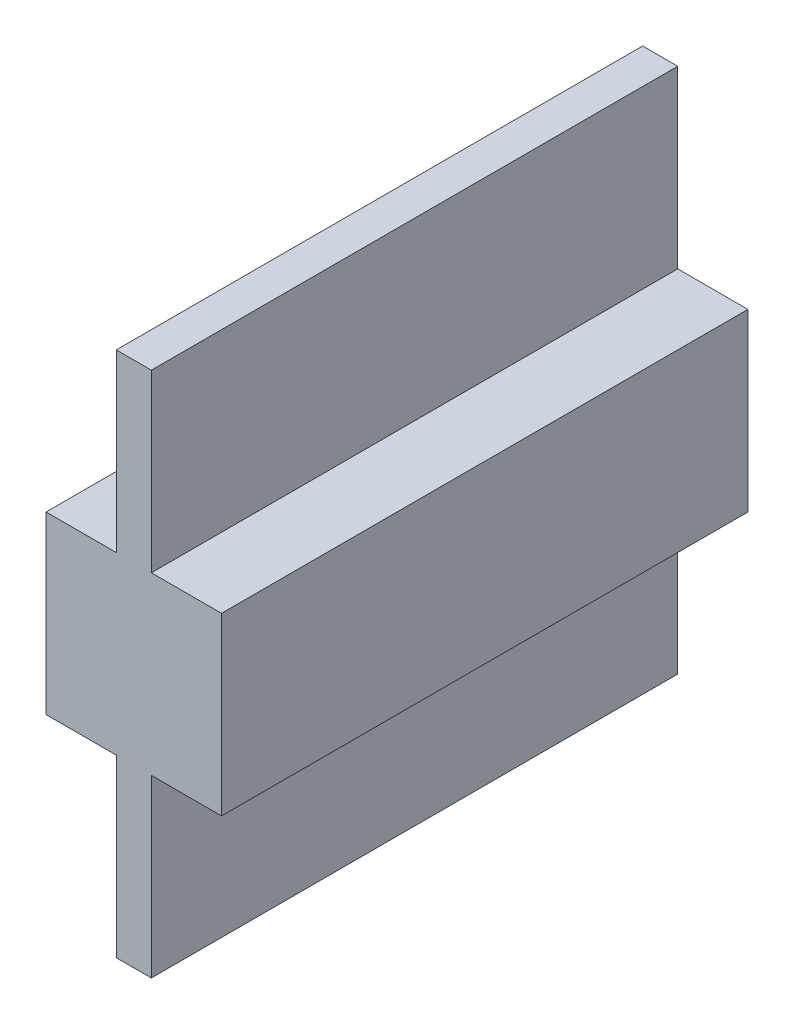
ISO-10303-21;
HEADER;
FILE_DESCRIPTION(('STEP AP214'),'2;1');
FILE_NAME('part.step','',(''),(''),'','','');
FILE_SCHEMA(('AUTOMOTIVE_DESIGN { 1 0 10303 214 1 1 1 1 }'));
ENDSEC;
DATA;
#1=APPLICATION_CONTEXT('core data for automotive mechanical design processes');
#2=APPLICATION_PROTOCOL_DEFINITION('international standard','automotive_design',2000,#1);
#3=PRODUCT_CONTEXT('',#1,'mechanical');
#4=PRODUCT('Part','Part','',(#3));
#5=PRODUCT_RELATED_PRODUCT_CATEGORY('part','',(#4));
#6=PRODUCT_DEFINITION_FORMATION('','',#4);
#7=PRODUCT_DEFINITION_CONTEXT('part definition',#1,'design');
#8=PRODUCT_DEFINITION('design','',#6,#7);
#9=PRODUCT_DEFINITION_SHAPE('','',#8);
#10=(LENGTH_UNIT() NAMED_UNIT(*) SI_UNIT(.MILLI.,.METRE.));
#11=(NAMED_UNIT(*) PLANE_ANGLE_UNIT() SI_UNIT($,.RADIAN.));
#12=(NAMED_UNIT(*) SI_UNIT($,.STERADIAN.) SOLID_ANGLE_UNIT());
#13=UNCERTAINTY_MEASURE_WITH_UNIT(LENGTH_MEASURE(1.E-05),#10,'distance_accuracy_value','');
#14=(GEOMETRIC_REPRESENTATION_CONTEXT(3) GLOBAL_UNCERTAINTY_ASSIGNED_CONTEXT((#13)) GLOBAL_UNIT_ASSIGNED_CONTEXT((#10,
#11,#12)) REPRESENTATION_CONTEXT('',''));
#15=CARTESIAN_POINT('',(0.,0.,0.));
#16=DIRECTION('',(0.,0.,1.));
#17=DIRECTION('',(1.,0.,0.));
#18=AXIS2_PLACEMENT_3D('',#15,#16,#17);
#19=CARTESIAN_POINT('',(50.,-50.,0.));
#20=DIRECTION('',(0.,-1.,0.));
#21=DIRECTION('',(0.,0.,-1.));
#22=AXIS2_PLACEMENT_3D('',#19,#20,#21);
#23=PLANE('',#22);
#24=DIRECTION('',(-1.,0.,0.));
#25=VECTOR('',#24,1.);
#26=CARTESIAN_POINT('',(50.,-50.,-150.));
#27=LINE('',#26,#25);
#28=CARTESIAN_POINT('',(-10.,-50.,-150.));
#29=VERTEX_POINT('',#28);
#30=CARTESIAN_POINT('',(-50.,-50.,-150.));
#31=VERTEX_POINT('',#30);
#32=EDGE_CURVE('E51',#29,#31,#27,.T.);
#33=ORIENTED_EDGE('',*,*,#32,.F.);
#34=DIRECTION('',(0.,0.,1.));
#35=VECTOR('',#34,1.);
#36=CARTESIAN_POINT('',(-10.,-50.,0.));
#37=LINE('',#36,#35);
#38=CARTESIAN_POINT('',(-10.,-50.,150.));
#39=VERTEX_POINT('',#38);
#40=EDGE_CURVE('E59',#29,#39,#37,.T.);
#41=ORIENTED_EDGE('',*,*,#40,.T.);
#42=DIRECTION('',(-1.,0.,0.));
#43=VECTOR('',#42,1.);
#44=CARTESIAN_POINT('',(50.,-50.,150.));
#45=LINE('',#44,#43);
#46=CARTESIAN_POINT('',(-50.,-50.,150.));
#47=VERTEX_POINT('',#46);
#48=EDGE_CURVE('E197',#39,#47,#45,.T.);
#49=ORIENTED_EDGE('',*,*,#48,.T.);
#50=DIRECTION('',(0.,0.,1.));
#51=VECTOR('',#50,1.);
#52=CARTESIAN_POINT('',(-50.,-50.,0.));
#53=LINE('',#52,#51);
#54=EDGE_CURVE('E152',#31,#47,#53,.T.);
#55=ORIENTED_EDGE('',*,*,#54,.F.);
#56=EDGE_LOOP('',(#33,#41,#49,#55));
#57=FACE_BOUND('',#56,.T.);
#58=ADVANCED_FACE('F43',(#57),#23,.T.);
#59=CARTESIAN_POINT('',(50.,50.,0.));
#60=DIRECTION('',(0.,-1.,0.));
#61=DIRECTION('',(0.,0.,-1.));
#62=AXIS2_PLACEMENT_3D('',#59,#60,#61);
#63=PLANE('',#62);
#64=DIRECTION('',(0.,0.,1.));
#65=VECTOR('',#64,1.);
#66=CARTESIAN_POINT('',(-10.,50.,0.));
#67=LINE('',#66,#65);
#68=CARTESIAN_POINT('',(-10.,50.,-150.));
#69=VERTEX_POINT('',#68);
#70=CARTESIAN_POINT('',(-10.,50.,150.));
#71=VERTEX_POINT('',#70);
#72=EDGE_CURVE('E146',#69,#71,#67,.T.);
#73=ORIENTED_EDGE('',*,*,#72,.F.);
#74=DIRECTION('',(-1.,0.,0.));
#75=VECTOR('',#74,1.);
#76=CARTESIAN_POINT('',(50.,50.,-150.));
#77=LINE('',#76,#75);
#78=CARTESIAN_POINT('',(-50.,50.,-150.));
#79=VERTEX_POINT('',#78);
#80=EDGE_CURVE('E211',#69,#79,#77,.T.);
#81=ORIENTED_EDGE('',*,*,#80,.T.);
#82=DIRECTION('',(0.,0.,1.));
#83=VECTOR('',#82,1.);
#84=CARTESIAN_POINT('',(-50.,50.,0.));
#85=LINE('',#84,#83);
#86=CARTESIAN_POINT('',(-50.,50.,150.));
#87=VERTEX_POINT('',#86);
#88=EDGE_CURVE('E203',#79,#87,#85,.T.);
#89=ORIENTED_EDGE('',*,*,#88,.T.);
#90=DIRECTION('',(-1.,0.,0.));
#91=VECTOR('',#90,1.);
#92=CARTESIAN_POINT('',(50.,50.,150.));
#93=LINE('',#92,#91);
#94=EDGE_CURVE('E208',#71,#87,#93,.T.);
#95=ORIENTED_EDGE('',*,*,#94,.F.);
#96=EDGE_LOOP('',(#73,#81,#89,#95));
#97=FACE_BOUND('',#96,.T.);
#98=ADVANCED_FACE('F217',(#97),#63,.F.);
#99=DIRECTION('',(0.,0.,1.));
#100=VECTOR('',#99,1.);
#101=CARTESIAN_POINT('',(10.,-50.,0.));
#102=LINE('',#101,#100);
#103=CARTESIAN_POINT('',(10.,-50.,-150.));
#104=VERTEX_POINT('',#103);
#105=CARTESIAN_POINT('',(10.,-50.,150.));
#106=VERTEX_POINT('',#105);
#107=EDGE_CURVE('E166',#104,#106,#102,.T.);
#108=ORIENTED_EDGE('',*,*,#107,.F.);
#109=CARTESIAN_POINT('',(50.,-50.,-150.));
#110=VERTEX_POINT('',#109);
#111=EDGE_CURVE('E11',#110,#104,#27,.T.);
#112=ORIENTED_EDGE('',*,*,#111,.F.);
#113=DIRECTION('',(0.,0.,1.));
#114=VECTOR('',#113,1.);
#115=CARTESIAN_POINT('',(50.,-50.,0.));
#116=LINE('',#115,#114);
#117=CARTESIAN_POINT('',(50.,-50.,150.));
#118=VERTEX_POINT('',#117);
#119=EDGE_CURVE('E187',#110,#118,#116,.T.);
#120=ORIENTED_EDGE('',*,*,#119,.T.);
#121=EDGE_CURVE('E206',#118,#106,#45,.T.);
#122=ORIENTED_EDGE('',*,*,#121,.T.);
#123=EDGE_LOOP('',(#108,#112,#120,#122));
#124=FACE_BOUND('',#123,.T.);
#125=ADVANCED_FACE('F44',(#124),#23,.T.);
#126=CARTESIAN_POINT('',(50.,0.,-150.));
#127=DIRECTION('',(0.,0.,-1.));
#128=DIRECTION('',(0.,1.,0.));
#129=AXIS2_PLACEMENT_3D('',#126,#127,#128);
#130=PLANE('',#129);
#131=DIRECTION('',(0.,-1.,0.));
#132=VECTOR('',#131,1.);
#133=CARTESIAN_POINT('',(-50.,0.,-150.));
#134=LINE('',#133,#132);
#135=EDGE_CURVE('E160',#79,#31,#134,.T.);
#136=ORIENTED_EDGE('',*,*,#135,.F.);
#137=ORIENTED_EDGE('',*,*,#80,.F.);
#138=DIRECTION('',(0.,1.,0.));
#139=VECTOR('',#138,1.);
#140=CARTESIAN_POINT('',(-10.,0.,-150.));
#141=LINE('',#140,#139);
#142=CARTESIAN_POINT('',(-10.,150.,-150.));
#143=VERTEX_POINT('',#142);
#144=EDGE_CURVE('E153',#69,#143,#141,.T.);
#145=ORIENTED_EDGE('',*,*,#144,.T.);
#146=DIRECTION('',(-1.,0.,0.));
#147=VECTOR('',#146,1.);
#148=CARTESIAN_POINT('',(10.,150.,-150.));
#149=LINE('',#148,#147);
#150=CARTESIAN_POINT('',(10.,150.,-150.));
#151=VERTEX_POINT('',#150);
#152=EDGE_CURVE('E133',#151,#143,#149,.T.);
#153=ORIENTED_EDGE('',*,*,#152,.F.);
#154=DIRECTION('',(0.,1.,0.));
#155=VECTOR('',#154,1.);
#156=CARTESIAN_POINT('',(10.,0.,-150.));
#157=LINE('',#156,#155);
#158=CARTESIAN_POINT('',(10.,50.,-150.));
#159=VERTEX_POINT('',#158);
#160=EDGE_CURVE('E137',#159,#151,#157,.T.);
#161=ORIENTED_EDGE('',*,*,#160,.F.);
#162=CARTESIAN_POINT('',(50.,50.,-150.));
#163=VERTEX_POINT('',#162);
#164=EDGE_CURVE('E215',#163,#159,#77,.T.);
#165=ORIENTED_EDGE('',*,*,#164,.F.);
#166=DIRECTION('',(0.,-1.,0.));
#167=VECTOR('',#166,1.);
#168=CARTESIAN_POINT('',(50.,0.,-150.));
#169=LINE('',#168,#167);
#170=EDGE_CURVE('E190',#163,#110,#169,.T.);
#171=ORIENTED_EDGE('',*,*,#170,.T.);
#172=ORIENTED_EDGE('',*,*,#111,.T.);
#173=DIRECTION('',(0.,-1.,0.));
#174=VECTOR('',#173,1.);
#175=CARTESIAN_POINT('',(10.,0.,-150.));
#176=LINE('',#175,#174);
#177=CARTESIAN_POINT('',(10.,-150.,-150.));
#178=VERTEX_POINT('',#177);
#179=EDGE_CURVE('E164',#104,#178,#176,.T.);
#180=ORIENTED_EDGE('',*,*,#179,.T.);
#181=DIRECTION('',(-1.,0.,0.));
#182=VECTOR('',#181,1.);
#183=CARTESIAN_POINT('',(10.,-150.,-150.));
#184=LINE('',#183,#182);
#185=CARTESIAN_POINT('',(-10.,-150.,-150.));
#186=VERTEX_POINT('',#185);
#187=EDGE_CURVE('E183',#178,#186,#184,.T.);
#188=ORIENTED_EDGE('',*,*,#187,.T.);
#189=DIRECTION('',(0.,-1.,0.));
#190=VECTOR('',#189,1.);
#191=CARTESIAN_POINT('',(-10.,0.,-150.));
#192=LINE('',#191,#190);
#193=EDGE_CURVE('E176',#29,#186,#192,.T.);
#194=ORIENTED_EDGE('',*,*,#193,.F.);
#195=ORIENTED_EDGE('',*,*,#32,.T.);
#196=EDGE_LOOP('',(#136,#137,#145,#153,#161,#165,#171,#172,#180,#188,#194,#195));
#197=FACE_BOUND('',#196,.T.);
#198=ADVANCED_FACE('F151',(#197),#130,.T.);
#199=ORIENTED_EDGE('',*,*,#164,.T.);
#200=DIRECTION('',(0.,0.,1.));
#201=VECTOR('',#200,1.);
#202=CARTESIAN_POINT('',(10.,50.,0.));
#203=LINE('',#202,#201);
#204=CARTESIAN_POINT('',(10.,50.,150.));
#205=VERTEX_POINT('',#204);
#206=EDGE_CURVE('E144',#159,#205,#203,.T.);
#207=ORIENTED_EDGE('',*,*,#206,.T.);
#208=CARTESIAN_POINT('',(50.,50.,150.));
#209=VERTEX_POINT('',#208);
#210=EDGE_CURVE('E207',#209,#205,#93,.T.);
#211=ORIENTED_EDGE('',*,*,#210,.F.);
#212=DIRECTION('',(0.,0.,1.));
#213=VECTOR('',#212,1.);
#214=CARTESIAN_POINT('',(50.,50.,0.));
#215=LINE('',#214,#213);
#216=EDGE_CURVE('E194',#163,#209,#215,.T.);
#217=ORIENTED_EDGE('',*,*,#216,.F.);
#218=EDGE_LOOP('',(#199,#207,#211,#217));
#219=FACE_BOUND('',#218,.T.);
#220=ADVANCED_FACE('F238',(#219),#63,.F.);
#221=CARTESIAN_POINT('',(50.,0.,150.));
#222=DIRECTION('',(0.,0.,-1.));
#223=DIRECTION('',(-1.,0.,0.));
#224=AXIS2_PLACEMENT_3D('',#221,#222,#223);
#225=PLANE('',#224);
#226=DIRECTION('',(0.,-1.,0.));
#227=VECTOR('',#226,1.);
#228=CARTESIAN_POINT('',(-50.,0.,150.));
#229=LINE('',#228,#227);
#230=EDGE_CURVE('E193',#87,#47,#229,.T.);
#231=ORIENTED_EDGE('',*,*,#230,.T.);
#232=ORIENTED_EDGE('',*,*,#48,.F.);
#233=DIRECTION('',(0.,-1.,0.));
#234=VECTOR('',#233,1.);
#235=CARTESIAN_POINT('',(-10.,0.,150.));
#236=LINE('',#235,#234);
#237=CARTESIAN_POINT('',(-10.,-150.,150.));
#238=VERTEX_POINT('',#237);
#239=EDGE_CURVE('E167',#39,#238,#236,.T.);
#240=ORIENTED_EDGE('',*,*,#239,.T.);
#241=DIRECTION('',(-1.,0.,0.));
#242=VECTOR('',#241,1.);
#243=CARTESIAN_POINT('',(10.,-150.,150.));
#244=LINE('',#243,#242);
#245=CARTESIAN_POINT('',(10.,-150.,150.));
#246=VERTEX_POINT('',#245);
#247=EDGE_CURVE('E173',#246,#238,#244,.T.);
#248=ORIENTED_EDGE('',*,*,#247,.F.);
#249=DIRECTION('',(0.,-1.,0.));
#250=VECTOR('',#249,1.);
#251=CARTESIAN_POINT('',(10.,0.,150.));
#252=LINE('',#251,#250);
#253=EDGE_CURVE('E172',#106,#246,#252,.T.);
#254=ORIENTED_EDGE('',*,*,#253,.F.);
#255=ORIENTED_EDGE('',*,*,#121,.F.);
#256=DIRECTION('',(0.,-1.,0.));
#257=VECTOR('',#256,1.);
#258=CARTESIAN_POINT('',(50.,0.,150.));
#259=LINE('',#258,#257);
#260=EDGE_CURVE('E198',#209,#118,#259,.T.);
#261=ORIENTED_EDGE('',*,*,#260,.F.);
#262=ORIENTED_EDGE('',*,*,#210,.T.);
#263=DIRECTION('',(0.,1.,0.));
#264=VECTOR('',#263,1.);
#265=CARTESIAN_POINT('',(10.,0.,150.));
#266=LINE('',#265,#264);
#267=CARTESIAN_POINT('',(10.,150.,150.));
#268=VERTEX_POINT('',#267);
#269=EDGE_CURVE('E139',#205,#268,#266,.T.);
#270=ORIENTED_EDGE('',*,*,#269,.T.);
#271=DIRECTION('',(-1.,0.,0.));
#272=VECTOR('',#271,1.);
#273=CARTESIAN_POINT('',(10.,150.,150.));
#274=LINE('',#273,#272);
#275=CARTESIAN_POINT('',(-10.,150.,150.));
#276=VERTEX_POINT('',#275);
#277=EDGE_CURVE('E138',#268,#276,#274,.T.);
#278=ORIENTED_EDGE('',*,*,#277,.T.);
#279=DIRECTION('',(0.,1.,0.));
#280=VECTOR('',#279,1.);
#281=CARTESIAN_POINT('',(-10.,0.,150.));
#282=LINE('',#281,#280);
#283=EDGE_CURVE('E228',#71,#276,#282,.T.);
#284=ORIENTED_EDGE('',*,*,#283,.F.);
#285=ORIENTED_EDGE('',*,*,#94,.T.);
#286=EDGE_LOOP('',(#231,#232,#240,#248,#254,#255,#261,#262,#270,#278,#284,#285));
#287=FACE_BOUND('',#286,.T.);
#288=ADVANCED_FACE('F227',(#287),#225,.F.);
#289=CARTESIAN_POINT('',(50.,0.,0.));
#290=DIRECTION('',(1.,0.,0.));
#291=DIRECTION('',(0.,0.,-1.));
#292=AXIS2_PLACEMENT_3D('',#289,#290,#291);
#293=PLANE('',#292);
#294=ORIENTED_EDGE('',*,*,#119,.F.);
#295=ORIENTED_EDGE('',*,*,#170,.F.);
#296=ORIENTED_EDGE('',*,*,#216,.T.);
#297=ORIENTED_EDGE('',*,*,#260,.T.);
#298=EDGE_LOOP('',(#294,#295,#296,#297));
#299=FACE_BOUND('',#298,.T.);
#300=ADVANCED_FACE('F248',(#299),#293,.T.);
#301=CARTESIAN_POINT('',(-50.,0.,0.));
#302=DIRECTION('',(1.,0.,0.));
#303=DIRECTION('',(0.,0.,-1.));
#304=AXIS2_PLACEMENT_3D('',#301,#302,#303);
#305=PLANE('',#304);
#306=ORIENTED_EDGE('',*,*,#54,.T.);
#307=ORIENTED_EDGE('',*,*,#230,.F.);
#308=ORIENTED_EDGE('',*,*,#88,.F.);
#309=ORIENTED_EDGE('',*,*,#135,.T.);
#310=EDGE_LOOP('',(#306,#307,#308,#309));
#311=FACE_BOUND('',#310,.T.);
#312=ADVANCED_FACE('F224',(#311),#305,.F.);
#313=CARTESIAN_POINT('',(10.,150.,0.));
#314=DIRECTION('',(0.,-1.,0.));
#315=DIRECTION('',(0.,0.,-1.));
#316=AXIS2_PLACEMENT_3D('',#313,#314,#315);
#317=PLANE('',#316);
#318=DIRECTION('',(0.,0.,1.));
#319=VECTOR('',#318,1.);
#320=CARTESIAN_POINT('',(-10.,150.,0.));
#321=LINE('',#320,#319);
#322=EDGE_CURVE('E233',#143,#276,#321,.T.);
#323=ORIENTED_EDGE('',*,*,#322,.T.);
#324=ORIENTED_EDGE('',*,*,#277,.F.);
#325=DIRECTION('',(0.,0.,1.));
#326=VECTOR('',#325,1.);
#327=CARTESIAN_POINT('',(10.,150.,0.));
#328=LINE('',#327,#326);
#329=EDGE_CURVE('E129',#151,#268,#328,.T.);
#330=ORIENTED_EDGE('',*,*,#329,.F.);
#331=ORIENTED_EDGE('',*,*,#152,.T.);
#332=EDGE_LOOP('',(#323,#324,#330,#331));
#333=FACE_BOUND('',#332,.T.);
#334=ADVANCED_FACE('F132',(#333),#317,.F.);
#335=CARTESIAN_POINT('',(10.,0.,0.));
#336=DIRECTION('',(1.,0.,0.));
#337=DIRECTION('',(0.,0.,-1.));
#338=AXIS2_PLACEMENT_3D('',#335,#336,#337);
#339=PLANE('',#338);
#340=ORIENTED_EDGE('',*,*,#160,.T.);
#341=ORIENTED_EDGE('',*,*,#329,.T.);
#342=ORIENTED_EDGE('',*,*,#269,.F.);
#343=ORIENTED_EDGE('',*,*,#206,.F.);
#344=EDGE_LOOP('',(#340,#341,#342,#343));
#345=FACE_BOUND('',#344,.T.);
#346=ADVANCED_FACE('F141',(#345),#339,.T.);
#347=CARTESIAN_POINT('',(-10.,0.,0.));
#348=DIRECTION('',(1.,0.,0.));
#349=DIRECTION('',(0.,0.,-1.));
#350=AXIS2_PLACEMENT_3D('',#347,#348,#349);
#351=PLANE('',#350);
#352=ORIENTED_EDGE('',*,*,#144,.F.);
#353=ORIENTED_EDGE('',*,*,#72,.T.);
#354=ORIENTED_EDGE('',*,*,#283,.T.);
#355=ORIENTED_EDGE('',*,*,#322,.F.);
#356=EDGE_LOOP('',(#352,#353,#354,#355));
#357=FACE_BOUND('',#356,.T.);
#358=ADVANCED_FACE('F231',(#357),#351,.F.);
#359=CARTESIAN_POINT('',(10.,-150.,0.));
#360=DIRECTION('',(0.,-1.,0.));
#361=DIRECTION('',(0.,0.,-1.));
#362=AXIS2_PLACEMENT_3D('',#359,#360,#361);
#363=PLANE('',#362);
#364=DIRECTION('',(0.,0.,1.));
#365=VECTOR('',#364,1.);
#366=CARTESIAN_POINT('',(-10.,-150.,0.));
#367=LINE('',#366,#365);
#368=EDGE_CURVE('E175',#186,#238,#367,.T.);
#369=ORIENTED_EDGE('',*,*,#368,.F.);
#370=ORIENTED_EDGE('',*,*,#187,.F.);
#371=DIRECTION('',(0.,0.,1.));
#372=VECTOR('',#371,1.);
#373=CARTESIAN_POINT('',(10.,-150.,0.));
#374=LINE('',#373,#372);
#375=EDGE_CURVE('E165',#178,#246,#374,.T.);
#376=ORIENTED_EDGE('',*,*,#375,.T.);
#377=ORIENTED_EDGE('',*,*,#247,.T.);
#378=EDGE_LOOP('',(#369,#370,#376,#377));
#379=FACE_BOUND('',#378,.T.);
#380=ADVANCED_FACE('F254',(#379),#363,.T.);
#381=CARTESIAN_POINT('',(10.,0.,0.));
#382=DIRECTION('',(1.,0.,0.));
#383=DIRECTION('',(0.,0.,-1.));
#384=AXIS2_PLACEMENT_3D('',#381,#382,#383);
#385=PLANE('',#384);
#386=ORIENTED_EDGE('',*,*,#375,.F.);
#387=ORIENTED_EDGE('',*,*,#179,.F.);
#388=ORIENTED_EDGE('',*,*,#107,.T.);
#389=ORIENTED_EDGE('',*,*,#253,.T.);
#390=EDGE_LOOP('',(#386,#387,#388,#389));
#391=FACE_BOUND('',#390,.T.);
#392=ADVANCED_FACE('F253',(#391),#385,.T.);
#393=CARTESIAN_POINT('',(-10.,0.,0.));
#394=DIRECTION('',(1.,0.,0.));
#395=DIRECTION('',(0.,0.,-1.));
#396=AXIS2_PLACEMENT_3D('',#393,#394,#395);
#397=PLANE('',#396);
#398=ORIENTED_EDGE('',*,*,#368,.T.);
#399=ORIENTED_EDGE('',*,*,#239,.F.);
#400=ORIENTED_EDGE('',*,*,#40,.F.);
#401=ORIENTED_EDGE('',*,*,#193,.T.);
#402=EDGE_LOOP('',(#398,#399,#400,#401));
#403=FACE_BOUND('',#402,.T.);
#404=ADVANCED_FACE('F260',(#403),#397,.F.);
#405=CLOSED_SHELL('',(#58,#98,#125,#198,#220,#288,#300,#312,#334,#346,#358,#380,#392,#404));
#406=MANIFOLD_SOLID_BREP('B2',#405);
#407=ADVANCED_BREP_SHAPE_REPRESENTATION('',(#18,#406),#14);
#408=SHAPE_DEFINITION_REPRESENTATION(#9,#407);
ENDSEC;
END-ISO-10303-21;
